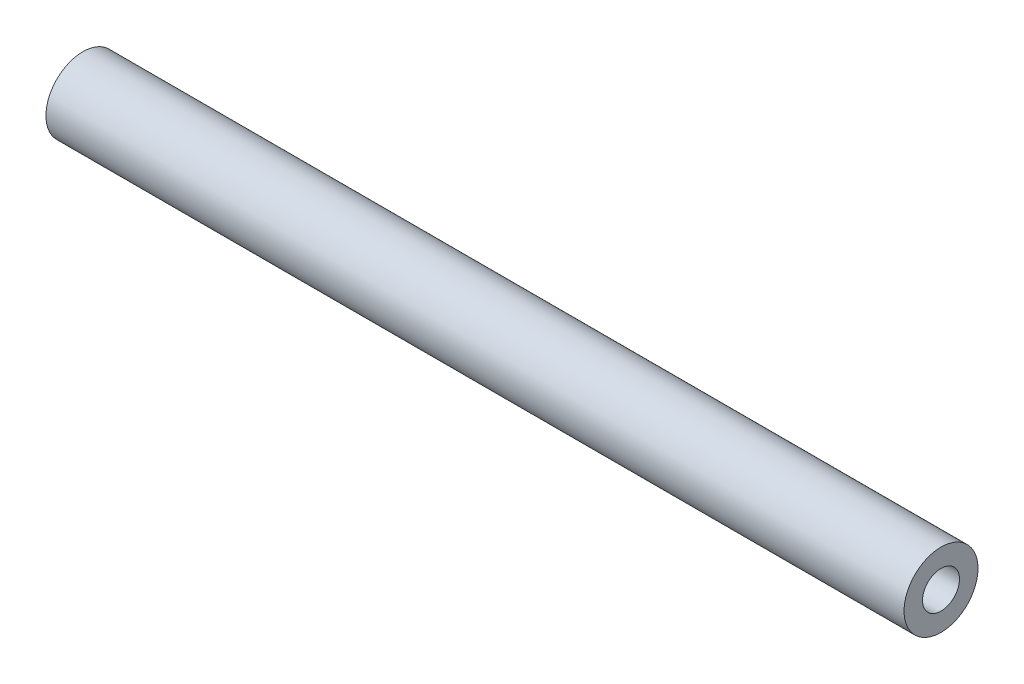
ISO-10303-21;
HEADER;
FILE_DESCRIPTION(('STEP AP214'),'2;1');
FILE_NAME('part.step','',(''),(''),'','','');
FILE_SCHEMA(('AUTOMOTIVE_DESIGN { 1 0 10303 214 1 1 1 1 }'));
ENDSEC;
DATA;
#1=APPLICATION_CONTEXT('core data for automotive mechanical design processes');
#2=APPLICATION_PROTOCOL_DEFINITION('international standard','automotive_design',2000,#1);
#3=PRODUCT_CONTEXT('',#1,'mechanical');
#4=PRODUCT('Part','Part','',(#3));
#5=PRODUCT_RELATED_PRODUCT_CATEGORY('part','',(#4));
#6=PRODUCT_DEFINITION_FORMATION('','',#4);
#7=PRODUCT_DEFINITION_CONTEXT('part definition',#1,'design');
#8=PRODUCT_DEFINITION('design','',#6,#7);
#9=PRODUCT_DEFINITION_SHAPE('','',#8);
#10=(LENGTH_UNIT() NAMED_UNIT(*) SI_UNIT(.MILLI.,.METRE.));
#11=(NAMED_UNIT(*) PLANE_ANGLE_UNIT() SI_UNIT($,.RADIAN.));
#12=(NAMED_UNIT(*) SI_UNIT($,.STERADIAN.) SOLID_ANGLE_UNIT());
#13=UNCERTAINTY_MEASURE_WITH_UNIT(LENGTH_MEASURE(1.E-05),#10,'distance_accuracy_value','');
#14=(GEOMETRIC_REPRESENTATION_CONTEXT(3) GLOBAL_UNCERTAINTY_ASSIGNED_CONTEXT((#13)) GLOBAL_UNIT_ASSIGNED_CONTEXT((#10,
#11,#12)) REPRESENTATION_CONTEXT('',''));
#15=CARTESIAN_POINT('',(0.,0.,0.));
#16=DIRECTION('',(0.,0.,1.));
#17=DIRECTION('',(1.,0.,0.));
#18=AXIS2_PLACEMENT_3D('',#15,#16,#17);
#19=CARTESIAN_POINT('',(-116.,0.,0.));
#20=DIRECTION('',(1.,0.,0.));
#21=DIRECTION('',(0.,0.,-1.));
#22=AXIS2_PLACEMENT_3D('',#19,#20,#21);
#23=CYLINDRICAL_SURFACE('',#22,5.);
#24=CARTESIAN_POINT('',(-116.,0.,0.));
#25=DIRECTION('',(1.,0.,0.));
#26=DIRECTION('',(0.,0.,-1.));
#27=AXIS2_PLACEMENT_3D('',#24,#25,#26);
#28=CIRCLE('',#27,5.);
#29=CARTESIAN_POINT('',(-116.,0.,-5.));
#30=VERTEX_POINT('',#29);
#31=EDGE_CURVE('E10',#30,#30,#28,.T.);
#32=CARTESIAN_POINT('',(0.,0.,0.));
#33=DIRECTION('',(1.,0.,0.));
#34=DIRECTION('',(0.,0.,-1.));
#35=AXIS2_PLACEMENT_3D('',#32,#33,#34);
#36=CIRCLE('',#35,5.);
#37=CARTESIAN_POINT('',(0.,0.,-5.));
#38=VERTEX_POINT('',#37);
#39=EDGE_CURVE('E34',#38,#38,#36,.T.);
#40=CARTESIAN_POINT('',(-116.,0.,-5.));
#41=CARTESIAN_POINT('',(-114.791666666667,0.,-5.));
#42=CARTESIAN_POINT('',(-113.583333333333,0.,-5.));
#43=CARTESIAN_POINT('',(-111.166666666667,0.,-5.));
#44=CARTESIAN_POINT('',(-109.958333333333,0.,-5.));
#45=CARTESIAN_POINT('',(-107.541666666667,0.,-5.));
#46=CARTESIAN_POINT('',(-106.333333333333,0.,-5.));
#47=CARTESIAN_POINT('',(-103.916666666667,0.,-5.));
#48=CARTESIAN_POINT('',(-102.708333333333,0.,-5.));
#49=CARTESIAN_POINT('',(-100.291666666667,0.,-5.));
#50=CARTESIAN_POINT('',(-99.0833333333333,0.,-5.));
#51=CARTESIAN_POINT('',(-96.6666666666667,0.,-5.));
#52=CARTESIAN_POINT('',(-95.4583333333334,0.,-5.));
#53=CARTESIAN_POINT('',(-93.0416666666667,0.,-5.));
#54=CARTESIAN_POINT('',(-91.8333333333334,0.,-5.));
#55=CARTESIAN_POINT('',(-89.4166666666667,0.,-5.));
#56=CARTESIAN_POINT('',(-88.2083333333333,0.,-5.));
#57=CARTESIAN_POINT('',(-85.7916666666667,0.,-5.));
#58=CARTESIAN_POINT('',(-84.5833333333333,0.,-5.));
#59=CARTESIAN_POINT('',(-82.1666666666667,0.,-5.));
#60=CARTESIAN_POINT('',(-80.9583333333333,0.,-5.));
#61=CARTESIAN_POINT('',(-78.5416666666667,0.,-5.));
#62=CARTESIAN_POINT('',(-77.3333333333333,0.,-5.));
#63=CARTESIAN_POINT('',(-74.9166666666667,0.,-5.));
#64=CARTESIAN_POINT('',(-73.7083333333333,0.,-5.));
#65=CARTESIAN_POINT('',(-71.2916666666667,0.,-5.));
#66=CARTESIAN_POINT('',(-70.0833333333333,0.,-5.));
#67=CARTESIAN_POINT('',(-67.6666666666667,0.,-5.));
#68=CARTESIAN_POINT('',(-66.4583333333333,0.,-5.));
#69=CARTESIAN_POINT('',(-64.0416666666667,0.,-5.));
#70=CARTESIAN_POINT('',(-62.8333333333333,0.,-5.));
#71=CARTESIAN_POINT('',(-60.4166666666667,0.,-5.));
#72=CARTESIAN_POINT('',(-59.2083333333333,0.,-5.));
#73=CARTESIAN_POINT('',(-56.7916666666667,0.,-5.));
#74=CARTESIAN_POINT('',(-55.5833333333333,0.,-5.));
#75=CARTESIAN_POINT('',(-53.1666666666667,0.,-5.));
#76=CARTESIAN_POINT('',(-51.9583333333333,0.,-5.));
#77=CARTESIAN_POINT('',(-49.5416666666667,0.,-5.));
#78=CARTESIAN_POINT('',(-48.3333333333333,0.,-5.));
#79=CARTESIAN_POINT('',(-45.9166666666667,0.,-5.));
#80=CARTESIAN_POINT('',(-44.7083333333333,0.,-5.));
#81=CARTESIAN_POINT('',(-42.2916666666667,0.,-5.));
#82=CARTESIAN_POINT('',(-41.0833333333333,0.,-5.));
#83=CARTESIAN_POINT('',(-38.6666666666667,0.,-5.));
#84=CARTESIAN_POINT('',(-37.4583333333333,0.,-5.));
#85=CARTESIAN_POINT('',(-35.0416666666667,0.,-5.));
#86=CARTESIAN_POINT('',(-33.8333333333333,0.,-5.));
#87=CARTESIAN_POINT('',(-31.4166666666667,0.,-5.));
#88=CARTESIAN_POINT('',(-30.2083333333333,0.,-5.));
#89=CARTESIAN_POINT('',(-27.7916666666667,0.,-5.));
#90=CARTESIAN_POINT('',(-26.5833333333333,0.,-5.));
#91=CARTESIAN_POINT('',(-24.1666666666667,0.,-5.));
#92=CARTESIAN_POINT('',(-22.9583333333333,0.,-5.));
#93=CARTESIAN_POINT('',(-20.5416666666667,0.,-5.));
#94=CARTESIAN_POINT('',(-19.3333333333333,0.,-5.));
#95=CARTESIAN_POINT('',(-16.9166666666667,0.,-5.));
#96=CARTESIAN_POINT('',(-15.7083333333333,0.,-5.));
#97=CARTESIAN_POINT('',(-13.2916666666667,0.,-5.));
#98=CARTESIAN_POINT('',(-12.0833333333333,0.,-5.));
#99=CARTESIAN_POINT('',(-9.66666666666667,0.,-5.));
#100=CARTESIAN_POINT('',(-8.45833333333334,0.,-5.));
#101=CARTESIAN_POINT('',(-6.04166666666667,0.,-5.));
#102=CARTESIAN_POINT('',(-4.83333333333334,0.,-5.));
#103=CARTESIAN_POINT('',(-2.41666666666667,0.,-5.));
#104=CARTESIAN_POINT('',(-1.20833333333333,0.,-5.));
#105=CARTESIAN_POINT('',(0.,0.,-5.));
#106=B_SPLINE_CURVE_WITH_KNOTS('',3,(#40,#41,#42,#43,#44,#45,#46,#47,#48,#49,#50,#51,#52,#53,
#54,#55,#56,#57,#58,#59,#60,#61,#62,#63,#64,#65,#66,#67,#68,#69,#70,#71,#72,#73,#74,#75,#76,#77,
#78,#79,#80,#81,#82,#83,#84,#85,#86,#87,#88,#89,#90,#91,#92,#93,#94,#95,#96,#97,#98,#99,#100,
#101,#102,#103,#104,#105),.UNSPECIFIED.,.F.,.F.,(4,2,2,2,2,2,2,2,2,2,2,2,2,2,2,2,2,2,2,2,2,2,2,
2,2,2,2,2,2,2,2,2,4),(0.,3.625,7.25000000000001,10.875,14.5,18.125,21.75,25.375,29.,32.625,
36.25,39.875,43.5,47.125,50.75,54.375,58.,61.625,65.25,68.875,72.5,76.125,79.75,83.375,87.,
90.625,94.25,97.875,101.5,105.125,108.75,112.375,116.),.UNSPECIFIED.);
#107=EDGE_CURVE('BSEAM31',#30,#38,#106,.T.);
#108=ORIENTED_EDGE('',*,*,#31,.T.);
#109=ORIENTED_EDGE('',*,*,#39,.F.);
#110=ORIENTED_EDGE('',*,*,#107,.T.);
#111=ORIENTED_EDGE('',*,*,#107,.F.);
#112=EDGE_LOOP('',(#108,#110,#109,#111));
#113=FACE_BOUND('',#112,.T.);
#114=ADVANCED_FACE('F31',(#113),#23,.T.);
#115=CARTESIAN_POINT('',(-116.,0.,0.));
#116=DIRECTION('',(1.,0.,0.));
#117=DIRECTION('',(0.,0.,-1.));
#118=AXIS2_PLACEMENT_3D('',#115,#116,#117);
#119=PLANE('',#118);
#120=ORIENTED_EDGE('',*,*,#31,.F.);
#121=EDGE_LOOP('',(#120));
#122=FACE_BOUND('',#121,.T.);
#123=ADVANCED_FACE('F60',(#122),#119,.F.);
#124=CARTESIAN_POINT('',(0.,0.,0.));
#125=DIRECTION('',(1.,0.,0.));
#126=DIRECTION('',(0.,0.,-1.));
#127=AXIS2_PLACEMENT_3D('',#124,#125,#126);
#128=PLANE('',#127);
#129=CARTESIAN_POINT('',(0.,0.,0.));
#130=DIRECTION('',(1.,0.,0.));
#131=DIRECTION('',(0.,0.,-1.));
#132=AXIS2_PLACEMENT_3D('',#129,#130,#131);
#133=CIRCLE('',#132,2.5);
#134=CARTESIAN_POINT('',(0.,0.,-2.5));
#135=VERTEX_POINT('',#134);
#136=EDGE_CURVE('E43',#135,#135,#133,.T.);
#137=ORIENTED_EDGE('',*,*,#136,.F.);
#138=EDGE_LOOP('',(#137));
#139=FACE_BOUND('',#138,.T.);
#140=ORIENTED_EDGE('',*,*,#39,.T.);
#141=EDGE_LOOP('',(#140));
#142=FACE_BOUND('',#141,.T.);
#143=ADVANCED_FACE('F54',(#139,#142),#128,.T.);
#144=CARTESIAN_POINT('',(-26.,0.,0.));
#145=DIRECTION('',(1.,0.,0.));
#146=DIRECTION('',(0.,0.,-1.));
#147=AXIS2_PLACEMENT_3D('',#144,#145,#146);
#148=CYLINDRICAL_SURFACE('',#147,2.5);
#149=CARTESIAN_POINT('',(-26.,0.,0.));
#150=DIRECTION('',(1.,0.,0.));
#151=DIRECTION('',(0.,0.,-1.));
#152=AXIS2_PLACEMENT_3D('',#149,#150,#151);
#153=CIRCLE('',#152,2.5);
#154=CARTESIAN_POINT('',(-26.,0.,-2.5));
#155=VERTEX_POINT('',#154);
#156=EDGE_CURVE('E41',#155,#155,#153,.T.);
#157=CARTESIAN_POINT('',(-26.,0.,-2.5));
#158=CARTESIAN_POINT('',(-25.7291666666667,0.,-2.5));
#159=CARTESIAN_POINT('',(-25.4583333333333,0.,-2.5));
#160=CARTESIAN_POINT('',(-24.9166666666667,0.,-2.5));
#161=CARTESIAN_POINT('',(-24.6458333333333,0.,-2.5));
#162=CARTESIAN_POINT('',(-24.1041666666667,0.,-2.5));
#163=CARTESIAN_POINT('',(-23.8333333333333,0.,-2.5));
#164=CARTESIAN_POINT('',(-23.2916666666667,0.,-2.5));
#165=CARTESIAN_POINT('',(-23.0208333333333,0.,-2.5));
#166=CARTESIAN_POINT('',(-22.4791666666667,0.,-2.5));
#167=CARTESIAN_POINT('',(-22.2083333333333,0.,-2.5));
#168=CARTESIAN_POINT('',(-21.6666666666667,0.,-2.5));
#169=CARTESIAN_POINT('',(-21.3958333333333,0.,-2.5));
#170=CARTESIAN_POINT('',(-20.8541666666667,0.,-2.5));
#171=CARTESIAN_POINT('',(-20.5833333333333,0.,-2.5));
#172=CARTESIAN_POINT('',(-20.0416666666667,0.,-2.5));
#173=CARTESIAN_POINT('',(-19.7708333333333,0.,-2.5));
#174=CARTESIAN_POINT('',(-19.2291666666667,0.,-2.5));
#175=CARTESIAN_POINT('',(-18.9583333333333,0.,-2.5));
#176=CARTESIAN_POINT('',(-18.4166666666667,0.,-2.5));
#177=CARTESIAN_POINT('',(-18.1458333333333,0.,-2.5));
#178=CARTESIAN_POINT('',(-17.6041666666667,0.,-2.5));
#179=CARTESIAN_POINT('',(-17.3333333333333,0.,-2.5));
#180=CARTESIAN_POINT('',(-16.7916666666667,0.,-2.5));
#181=CARTESIAN_POINT('',(-16.5208333333333,0.,-2.5));
#182=CARTESIAN_POINT('',(-15.9791666666667,0.,-2.5));
#183=CARTESIAN_POINT('',(-15.7083333333333,0.,-2.5));
#184=CARTESIAN_POINT('',(-15.1666666666667,0.,-2.5));
#185=CARTESIAN_POINT('',(-14.8958333333333,0.,-2.5));
#186=CARTESIAN_POINT('',(-14.3541666666667,0.,-2.5));
#187=CARTESIAN_POINT('',(-14.0833333333333,0.,-2.5));
#188=CARTESIAN_POINT('',(-13.5416666666667,0.,-2.5));
#189=CARTESIAN_POINT('',(-13.2708333333333,0.,-2.5));
#190=CARTESIAN_POINT('',(-12.7291666666667,0.,-2.5));
#191=CARTESIAN_POINT('',(-12.4583333333333,0.,-2.5));
#192=CARTESIAN_POINT('',(-11.9166666666667,0.,-2.5));
#193=CARTESIAN_POINT('',(-11.6458333333333,0.,-2.5));
#194=CARTESIAN_POINT('',(-11.1041666666667,0.,-2.5));
#195=CARTESIAN_POINT('',(-10.8333333333333,0.,-2.5));
#196=CARTESIAN_POINT('',(-10.2916666666667,0.,-2.5));
#197=CARTESIAN_POINT('',(-10.0208333333333,0.,-2.5));
#198=CARTESIAN_POINT('',(-9.47916666666667,0.,-2.5));
#199=CARTESIAN_POINT('',(-9.20833333333333,0.,-2.5));
#200=CARTESIAN_POINT('',(-8.66666666666667,0.,-2.5));
#201=CARTESIAN_POINT('',(-8.39583333333333,0.,-2.5));
#202=CARTESIAN_POINT('',(-7.85416666666667,0.,-2.5));
#203=CARTESIAN_POINT('',(-7.58333333333333,0.,-2.5));
#204=CARTESIAN_POINT('',(-7.04166666666667,0.,-2.5));
#205=CARTESIAN_POINT('',(-6.77083333333334,0.,-2.5));
#206=CARTESIAN_POINT('',(-6.22916666666667,0.,-2.5));
#207=CARTESIAN_POINT('',(-5.95833333333334,0.,-2.5));
#208=CARTESIAN_POINT('',(-5.41666666666667,0.,-2.5));
#209=CARTESIAN_POINT('',(-5.14583333333333,0.,-2.5));
#210=CARTESIAN_POINT('',(-4.60416666666667,0.,-2.5));
#211=CARTESIAN_POINT('',(-4.33333333333333,0.,-2.5));
#212=CARTESIAN_POINT('',(-3.79166666666667,0.,-2.5));
#213=CARTESIAN_POINT('',(-3.52083333333333,0.,-2.5));
#214=CARTESIAN_POINT('',(-2.97916666666667,0.,-2.5));
#215=CARTESIAN_POINT('',(-2.70833333333333,0.,-2.5));
#216=CARTESIAN_POINT('',(-2.16666666666667,0.,-2.5));
#217=CARTESIAN_POINT('',(-1.89583333333333,0.,-2.5));
#218=CARTESIAN_POINT('',(-1.35416666666667,0.,-2.5));
#219=CARTESIAN_POINT('',(-1.08333333333333,0.,-2.5));
#220=CARTESIAN_POINT('',(-0.541666666666667,0.,-2.5));
#221=CARTESIAN_POINT('',(-0.270833333333333,0.,-2.5));
#222=CARTESIAN_POINT('',(0.,0.,-2.5));
#223=B_SPLINE_CURVE_WITH_KNOTS('',3,(#157,#158,#159,#160,#161,#162,#163,#164,#165,#166,#167,
#168,#169,#170,#171,#172,#173,#174,#175,#176,#177,#178,#179,#180,#181,#182,#183,#184,#185,#186,
#187,#188,#189,#190,#191,#192,#193,#194,#195,#196,#197,#198,#199,#200,#201,#202,#203,#204,#205,
#206,#207,#208,#209,#210,#211,#212,#213,#214,#215,#216,#217,#218,#219,#220,#221,#222),
.UNSPECIFIED.,.F.,.F.,(4,2,2,2,2,2,2,2,2,2,2,2,2,2,2,2,2,2,2,2,2,2,2,2,2,2,2,2,2,2,2,2,4),(0.,
0.812500000000001,1.625,2.4375,3.25,4.0625,4.875,5.6875,6.5,7.3125,8.125,8.9375,9.75,10.5625,
11.375,12.1875,13.,13.8125,14.625,15.4375,16.25,17.0625,17.875,18.6875,19.5,20.3125,21.125,
21.9375,22.75,23.5625,24.375,25.1875,26.),.UNSPECIFIED.);
#224=EDGE_CURVE('BSEAM51',#155,#135,#223,.T.);
#225=ORIENTED_EDGE('',*,*,#156,.F.);
#226=ORIENTED_EDGE('',*,*,#136,.T.);
#227=ORIENTED_EDGE('',*,*,#224,.T.);
#228=ORIENTED_EDGE('',*,*,#224,.F.);
#229=EDGE_LOOP('',(#225,#227,#226,#228));
#230=FACE_BOUND('',#229,.T.);
#231=ADVANCED_FACE('F51',(#230),#148,.F.);
#232=CARTESIAN_POINT('',(-26.,0.,0.));
#233=DIRECTION('',(1.,0.,0.));
#234=DIRECTION('',(0.,0.,-1.));
#235=AXIS2_PLACEMENT_3D('',#232,#233,#234);
#236=PLANE('',#235);
#237=ORIENTED_EDGE('',*,*,#156,.T.);
#238=EDGE_LOOP('',(#237));
#239=FACE_BOUND('',#238,.T.);
#240=ADVANCED_FACE('F49',(#239),#236,.T.);
#241=CLOSED_SHELL('',(#114,#123,#143,#231,#240));
#242=MANIFOLD_SOLID_BREP('B2',#241);
#243=ADVANCED_BREP_SHAPE_REPRESENTATION('',(#18,#242),#14);
#244=SHAPE_DEFINITION_REPRESENTATION(#9,#243);
ENDSEC;
END-ISO-10303-21;
